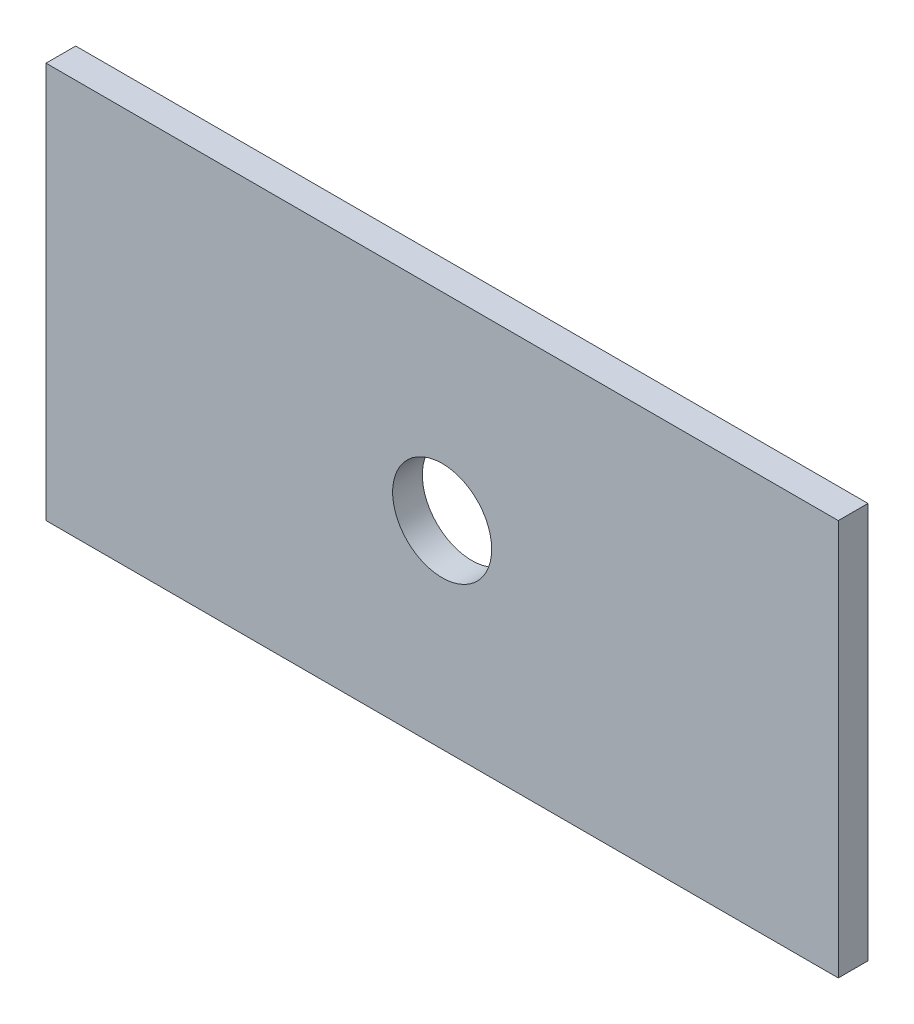
ISO-10303-21;
HEADER;
FILE_DESCRIPTION(('STEP AP214'),'2;1');
FILE_NAME('part.step','',(''),(''),'','','');
FILE_SCHEMA(('AUTOMOTIVE_DESIGN { 1 0 10303 214 1 1 1 1 }'));
ENDSEC;
DATA;
#1=APPLICATION_CONTEXT('core data for automotive mechanical design processes');
#2=APPLICATION_PROTOCOL_DEFINITION('international standard','automotive_design',2000,#1);
#3=PRODUCT_CONTEXT('',#1,'mechanical');
#4=PRODUCT('Part','Part','',(#3));
#5=PRODUCT_RELATED_PRODUCT_CATEGORY('part','',(#4));
#6=PRODUCT_DEFINITION_FORMATION('','',#4);
#7=PRODUCT_DEFINITION_CONTEXT('part definition',#1,'design');
#8=PRODUCT_DEFINITION('design','',#6,#7);
#9=PRODUCT_DEFINITION_SHAPE('','',#8);
#10=(LENGTH_UNIT() NAMED_UNIT(*) SI_UNIT(.MILLI.,.METRE.));
#11=(NAMED_UNIT(*) PLANE_ANGLE_UNIT() SI_UNIT($,.RADIAN.));
#12=(NAMED_UNIT(*) SI_UNIT($,.STERADIAN.) SOLID_ANGLE_UNIT());
#13=UNCERTAINTY_MEASURE_WITH_UNIT(LENGTH_MEASURE(1.E-05),#10,'distance_accuracy_value','');
#14=(GEOMETRIC_REPRESENTATION_CONTEXT(3) GLOBAL_UNCERTAINTY_ASSIGNED_CONTEXT((#13)) GLOBAL_UNIT_ASSIGNED_CONTEXT((#10,
#11,#12)) REPRESENTATION_CONTEXT('',''));
#15=CARTESIAN_POINT('',(0.,0.,0.));
#16=DIRECTION('',(0.,0.,1.));
#17=DIRECTION('',(1.,0.,0.));
#18=AXIS2_PLACEMENT_3D('',#15,#16,#17);
#19=CARTESIAN_POINT('',(0.,0.,3.));
#20=DIRECTION('',(0.,0.,1.));
#21=DIRECTION('',(1.,0.,0.));
#22=AXIS2_PLACEMENT_3D('',#19,#20,#21);
#23=PLANE('',#22);
#24=DIRECTION('',(0.,1.,0.));
#25=VECTOR('',#24,1.);
#26=CARTESIAN_POINT('',(20.2030508910442,26.0931385351802,3.));
#27=LINE('',#26,#25);
#28=CARTESIAN_POINT('',(20.2030508910442,-13.9068614648198,3.));
#29=VERTEX_POINT('',#28);
#30=CARTESIAN_POINT('',(20.2030508910442,26.0931385351802,3.));
#31=VERTEX_POINT('',#30);
#32=EDGE_CURVE('E92',#29,#31,#27,.T.);
#33=ORIENTED_EDGE('',*,*,#32,.T.);
#34=DIRECTION('',(-1.,0.,0.));
#35=VECTOR('',#34,1.);
#36=CARTESIAN_POINT('',(-59.7969491089558,26.0931385351802,3.));
#37=LINE('',#36,#35);
#38=CARTESIAN_POINT('',(-59.7969491089558,26.0931385351802,3.));
#39=VERTEX_POINT('',#38);
#40=EDGE_CURVE('E87',#31,#39,#37,.T.);
#41=ORIENTED_EDGE('',*,*,#40,.T.);
#42=DIRECTION('',(0.,-1.,0.));
#43=VECTOR('',#42,1.);
#44=CARTESIAN_POINT('',(-59.7969491089558,26.0931385351802,3.));
#45=LINE('',#44,#43);
#46=CARTESIAN_POINT('',(-59.7969491089558,-13.9068614648198,3.));
#47=VERTEX_POINT('',#46);
#48=EDGE_CURVE('E90',#39,#47,#45,.T.);
#49=ORIENTED_EDGE('',*,*,#48,.T.);
#50=DIRECTION('',(1.,0.,0.));
#51=VECTOR('',#50,1.);
#52=CARTESIAN_POINT('',(-59.7969491089558,-13.9068614648198,3.));
#53=LINE('',#52,#51);
#54=EDGE_CURVE('E57',#47,#29,#53,.T.);
#55=ORIENTED_EDGE('',*,*,#54,.T.);
#56=EDGE_LOOP('',(#33,#41,#49,#55));
#57=FACE_BOUND('',#56,.T.);
#58=CARTESIAN_POINT('',(-19.7969491089558,6.09313853518018,3.));
#59=DIRECTION('',(0.,0.,1.));
#60=DIRECTION('',(1.,0.,0.));
#61=AXIS2_PLACEMENT_3D('',#58,#59,#60);
#62=CIRCLE('',#61,5.);
#63=CARTESIAN_POINT('',(-14.7969491089558,6.09313853518018,3.));
#64=VERTEX_POINT('',#63);
#65=EDGE_CURVE('E112',#64,#64,#62,.T.);
#66=ORIENTED_EDGE('',*,*,#65,.F.);
#67=EDGE_LOOP('',(#66));
#68=FACE_BOUND('',#67,.T.);
#69=ADVANCED_FACE('F39',(#57,#68),#23,.T.);
#70=CARTESIAN_POINT('',(0.,0.,0.));
#71=DIRECTION('',(0.,0.,1.));
#72=DIRECTION('',(1.,0.,0.));
#73=AXIS2_PLACEMENT_3D('',#70,#71,#72);
#74=PLANE('',#73);
#75=DIRECTION('',(0.,1.,0.));
#76=VECTOR('',#75,1.);
#77=CARTESIAN_POINT('',(20.2030508910442,26.0931385351802,0.));
#78=LINE('',#77,#76);
#79=CARTESIAN_POINT('',(20.2030508910442,-13.9068614648198,0.));
#80=VERTEX_POINT('',#79);
#81=CARTESIAN_POINT('',(20.2030508910442,26.0931385351802,0.));
#82=VERTEX_POINT('',#81);
#83=EDGE_CURVE('E108',#80,#82,#78,.T.);
#84=ORIENTED_EDGE('',*,*,#83,.F.);
#85=DIRECTION('',(1.,0.,0.));
#86=VECTOR('',#85,1.);
#87=CARTESIAN_POINT('',(-59.7969491089558,-13.9068614648198,0.));
#88=LINE('',#87,#86);
#89=CARTESIAN_POINT('',(-59.7969491089558,-13.9068614648198,0.));
#90=VERTEX_POINT('',#89);
#91=EDGE_CURVE('E80',#90,#80,#88,.T.);
#92=ORIENTED_EDGE('',*,*,#91,.F.);
#93=DIRECTION('',(0.,-1.,0.));
#94=VECTOR('',#93,1.);
#95=CARTESIAN_POINT('',(-59.7969491089558,26.0931385351802,0.));
#96=LINE('',#95,#94);
#97=CARTESIAN_POINT('',(-59.7969491089558,26.0931385351802,0.));
#98=VERTEX_POINT('',#97);
#99=EDGE_CURVE('E74',#98,#90,#96,.T.);
#100=ORIENTED_EDGE('',*,*,#99,.F.);
#101=DIRECTION('',(-1.,0.,0.));
#102=VECTOR('',#101,1.);
#103=CARTESIAN_POINT('',(-59.7969491089558,26.0931385351802,0.));
#104=LINE('',#103,#102);
#105=EDGE_CURVE('E97',#82,#98,#104,.T.);
#106=ORIENTED_EDGE('',*,*,#105,.F.);
#107=EDGE_LOOP('',(#84,#92,#100,#106));
#108=FACE_BOUND('',#107,.T.);
#109=CARTESIAN_POINT('',(-19.7969491089558,6.09313853518018,0.));
#110=DIRECTION('',(0.,0.,1.));
#111=DIRECTION('',(1.,0.,0.));
#112=AXIS2_PLACEMENT_3D('',#109,#110,#111);
#113=CIRCLE('',#112,5.);
#114=CARTESIAN_POINT('',(-14.7969491089558,6.09313853518018,0.));
#115=VERTEX_POINT('',#114);
#116=EDGE_CURVE('E130',#115,#115,#113,.T.);
#117=ORIENTED_EDGE('',*,*,#116,.T.);
#118=EDGE_LOOP('',(#117));
#119=FACE_BOUND('',#118,.T.);
#120=ADVANCED_FACE('F125',(#108,#119),#74,.F.);
#121=CARTESIAN_POINT('',(20.2030508910442,26.0931385351802,3.));
#122=DIRECTION('',(-1.,0.,0.));
#123=DIRECTION('',(0.,0.,1.));
#124=AXIS2_PLACEMENT_3D('',#121,#122,#123);
#125=PLANE('',#124);
#126=ORIENTED_EDGE('',*,*,#83,.T.);
#127=DIRECTION('',(0.,0.,-1.));
#128=VECTOR('',#127,1.);
#129=CARTESIAN_POINT('',(20.2030508910442,26.0931385351802,3.));
#130=LINE('',#129,#128);
#131=EDGE_CURVE('E11',#31,#82,#130,.T.);
#132=ORIENTED_EDGE('',*,*,#131,.F.);
#133=ORIENTED_EDGE('',*,*,#32,.F.);
#134=DIRECTION('',(0.,0.,-1.));
#135=VECTOR('',#134,1.);
#136=CARTESIAN_POINT('',(20.2030508910442,-13.9068614648198,3.));
#137=LINE('',#136,#135);
#138=EDGE_CURVE('E104',#29,#80,#137,.T.);
#139=ORIENTED_EDGE('',*,*,#138,.T.);
#140=EDGE_LOOP('',(#126,#132,#133,#139));
#141=FACE_BOUND('',#140,.T.);
#142=ADVANCED_FACE('F41',(#141),#125,.F.);
#143=CARTESIAN_POINT('',(-59.7969491089558,26.0931385351802,3.));
#144=DIRECTION('',(0.,-1.,0.));
#145=DIRECTION('',(0.,0.,-1.));
#146=AXIS2_PLACEMENT_3D('',#143,#144,#145);
#147=PLANE('',#146);
#148=ORIENTED_EDGE('',*,*,#105,.T.);
#149=DIRECTION('',(0.,0.,-1.));
#150=VECTOR('',#149,1.);
#151=CARTESIAN_POINT('',(-59.7969491089558,26.0931385351802,3.));
#152=LINE('',#151,#150);
#153=EDGE_CURVE('E49',#39,#98,#152,.T.);
#154=ORIENTED_EDGE('',*,*,#153,.F.);
#155=ORIENTED_EDGE('',*,*,#40,.F.);
#156=ORIENTED_EDGE('',*,*,#131,.T.);
#157=EDGE_LOOP('',(#148,#154,#155,#156));
#158=FACE_BOUND('',#157,.T.);
#159=ADVANCED_FACE('F96',(#158),#147,.F.);
#160=CARTESIAN_POINT('',(-59.7969491089558,26.0931385351802,3.));
#161=DIRECTION('',(1.,0.,0.));
#162=DIRECTION('',(0.,0.,-1.));
#163=AXIS2_PLACEMENT_3D('',#160,#161,#162);
#164=PLANE('',#163);
#165=ORIENTED_EDGE('',*,*,#99,.T.);
#166=DIRECTION('',(0.,0.,-1.));
#167=VECTOR('',#166,1.);
#168=CARTESIAN_POINT('',(-59.7969491089558,-13.9068614648198,3.));
#169=LINE('',#168,#167);
#170=EDGE_CURVE('E99',#47,#90,#169,.T.);
#171=ORIENTED_EDGE('',*,*,#170,.F.);
#172=ORIENTED_EDGE('',*,*,#48,.F.);
#173=ORIENTED_EDGE('',*,*,#153,.T.);
#174=EDGE_LOOP('',(#165,#171,#172,#173));
#175=FACE_BOUND('',#174,.T.);
#176=ADVANCED_FACE('F100',(#175),#164,.F.);
#177=CARTESIAN_POINT('',(-59.7969491089558,-13.9068614648198,3.));
#178=DIRECTION('',(0.,1.,0.));
#179=DIRECTION('',(0.,0.,1.));
#180=AXIS2_PLACEMENT_3D('',#177,#178,#179);
#181=PLANE('',#180);
#182=ORIENTED_EDGE('',*,*,#91,.T.);
#183=ORIENTED_EDGE('',*,*,#138,.F.);
#184=ORIENTED_EDGE('',*,*,#54,.F.);
#185=ORIENTED_EDGE('',*,*,#170,.T.);
#186=EDGE_LOOP('',(#182,#183,#184,#185));
#187=FACE_BOUND('',#186,.T.);
#188=ADVANCED_FACE('F122',(#187),#181,.F.);
#189=CARTESIAN_POINT('',(-19.7969491089558,6.09313853518018,3.));
#190=DIRECTION('',(0.,0.,-1.));
#191=DIRECTION('',(-1.,0.,0.));
#192=AXIS2_PLACEMENT_3D('',#189,#190,#191);
#193=CYLINDRICAL_SURFACE('',#192,5.);
#194=ORIENTED_EDGE('',*,*,#65,.T.);
#195=EDGE_LOOP('',(#194));
#196=FACE_BOUND('',#195,.T.);
#197=ORIENTED_EDGE('',*,*,#116,.F.);
#198=EDGE_LOOP('',(#197));
#199=FACE_BOUND('',#198,.T.);
#200=ADVANCED_FACE('F138',(#196,#199),#193,.F.);
#201=CLOSED_SHELL('',(#69,#120,#142,#159,#176,#188,#200));
#202=MANIFOLD_SOLID_BREP('B2',#201);
#203=ADVANCED_BREP_SHAPE_REPRESENTATION('',(#18,#202),#14);
#204=SHAPE_DEFINITION_REPRESENTATION(#9,#203);
ENDSEC;
END-ISO-10303-21;
